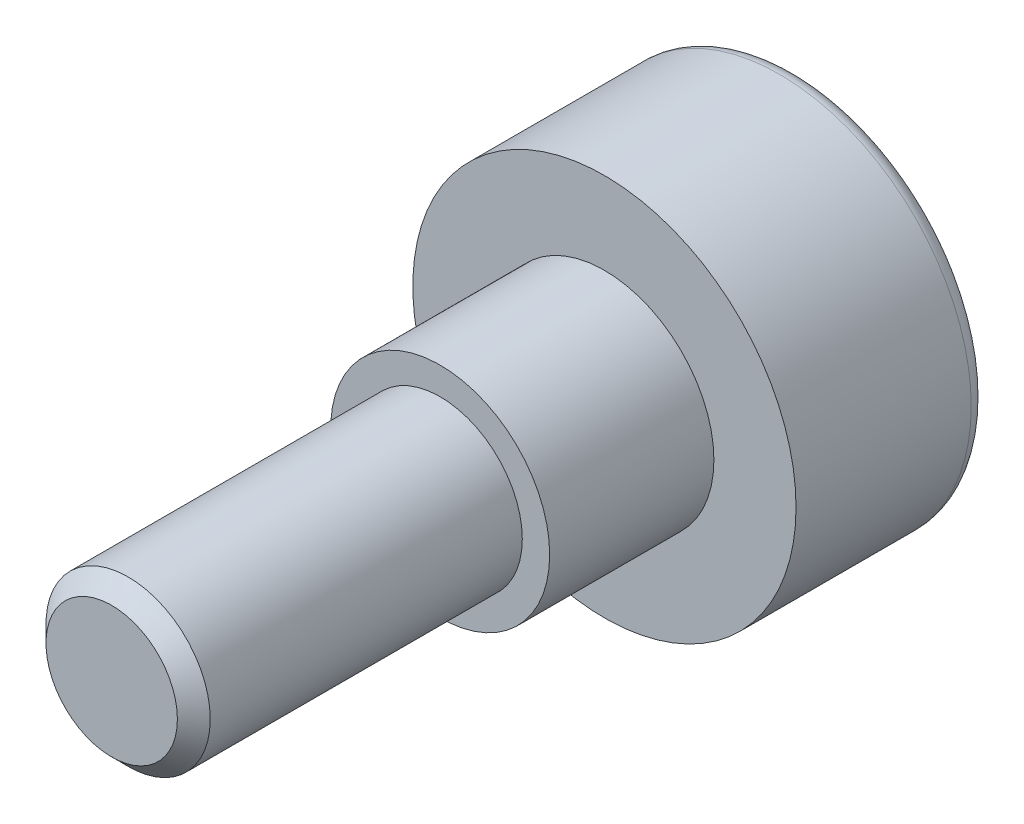
ISO-10303-21;
HEADER;
FILE_DESCRIPTION(('STEP AP214'),'2;1');
FILE_NAME('part.step','',(''),(''),'','','');
FILE_SCHEMA(('AUTOMOTIVE_DESIGN { 1 0 10303 214 1 1 1 1 }'));
ENDSEC;
DATA;
#1=APPLICATION_CONTEXT('core data for automotive mechanical design processes');
#2=APPLICATION_PROTOCOL_DEFINITION('international standard','automotive_design',2000,#1);
#3=PRODUCT_CONTEXT('',#1,'mechanical');
#4=PRODUCT('Part','Part','',(#3));
#5=PRODUCT_RELATED_PRODUCT_CATEGORY('part','',(#4));
#6=PRODUCT_DEFINITION_FORMATION('','',#4);
#7=PRODUCT_DEFINITION_CONTEXT('part definition',#1,'design');
#8=PRODUCT_DEFINITION('design','',#6,#7);
#9=PRODUCT_DEFINITION_SHAPE('','',#8);
#10=(LENGTH_UNIT() NAMED_UNIT(*) SI_UNIT(.MILLI.,.METRE.));
#11=(NAMED_UNIT(*) PLANE_ANGLE_UNIT() SI_UNIT($,.RADIAN.));
#12=(NAMED_UNIT(*) SI_UNIT($,.STERADIAN.) SOLID_ANGLE_UNIT());
#13=UNCERTAINTY_MEASURE_WITH_UNIT(LENGTH_MEASURE(1.E-05),#10,'distance_accuracy_value','');
#14=(GEOMETRIC_REPRESENTATION_CONTEXT(3) GLOBAL_UNCERTAINTY_ASSIGNED_CONTEXT((#13)) GLOBAL_UNIT_ASSIGNED_CONTEXT((#10,
#11,#12)) REPRESENTATION_CONTEXT('',''));
#15=CARTESIAN_POINT('',(0.,0.,0.));
#16=DIRECTION('',(0.,0.,1.));
#17=DIRECTION('',(1.,0.,0.));
#18=AXIS2_PLACEMENT_3D('',#15,#16,#17);
#19=CARTESIAN_POINT('',(0.,0.,3.5));
#20=DIRECTION('',(0.,0.,-1.));
#21=DIRECTION('',(-1.,0.,0.));
#22=AXIS2_PLACEMENT_3D('',#19,#20,#21);
#23=CYLINDRICAL_SURFACE('',#22,3.5);
#24=CARTESIAN_POINT('',(0.,0.,0.3));
#25=DIRECTION('',(0.,0.,1.));
#26=DIRECTION('',(1.,0.,0.));
#27=AXIS2_PLACEMENT_3D('',#24,#25,#26);
#28=CIRCLE('',#27,3.5);
#29=CARTESIAN_POINT('',(3.5,0.,0.3));
#30=VERTEX_POINT('',#29);
#31=EDGE_CURVE('E25',#30,#30,#28,.T.);
#32=ORIENTED_EDGE('',*,*,#31,.T.);
#33=EDGE_LOOP('',(#32));
#34=FACE_BOUND('',#33,.T.);
#35=CARTESIAN_POINT('',(0.,0.,3.5));
#36=DIRECTION('',(0.,0.,1.));
#37=DIRECTION('',(1.,0.,0.));
#38=AXIS2_PLACEMENT_3D('',#35,#36,#37);
#39=CIRCLE('',#38,3.5);
#40=CARTESIAN_POINT('',(3.5,0.,3.5));
#41=VERTEX_POINT('',#40);
#42=EDGE_CURVE('E131',#41,#41,#39,.T.);
#43=ORIENTED_EDGE('',*,*,#42,.F.);
#44=EDGE_LOOP('',(#43));
#45=FACE_BOUND('',#44,.T.);
#46=ADVANCED_FACE('F17',(#34,#45),#23,.T.);
#47=CARTESIAN_POINT('',(0.,0.,3.5));
#48=DIRECTION('',(0.,0.,1.));
#49=DIRECTION('',(1.,0.,0.));
#50=AXIS2_PLACEMENT_3D('',#47,#48,#49);
#51=PLANE('',#50);
#52=CARTESIAN_POINT('',(0.,0.,3.5));
#53=DIRECTION('',(0.,0.,1.));
#54=DIRECTION('',(1.,0.,0.));
#55=AXIS2_PLACEMENT_3D('',#52,#53,#54);
#56=CIRCLE('',#55,2.);
#57=CARTESIAN_POINT('',(2.,0.,3.5));
#58=VERTEX_POINT('',#57);
#59=EDGE_CURVE('E126',#58,#58,#56,.T.);
#60=ORIENTED_EDGE('',*,*,#59,.F.);
#61=EDGE_LOOP('',(#60));
#62=FACE_BOUND('',#61,.T.);
#63=ORIENTED_EDGE('',*,*,#42,.T.);
#64=EDGE_LOOP('',(#63));
#65=FACE_BOUND('',#64,.T.);
#66=ADVANCED_FACE('F160',(#62,#65),#51,.T.);
#67=CARTESIAN_POINT('',(0.,0.,0.));
#68=DIRECTION('',(0.,0.,1.));
#69=DIRECTION('',(1.,0.,0.));
#70=AXIS2_PLACEMENT_3D('',#67,#68,#69);
#71=PLANE('',#70);
#72=CARTESIAN_POINT('',(0.,0.,0.));
#73=DIRECTION('',(0.,0.,1.));
#74=DIRECTION('',(1.,0.,0.));
#75=AXIS2_PLACEMENT_3D('',#72,#73,#74);
#76=CIRCLE('',#75,3.2);
#77=CARTESIAN_POINT('',(3.2,0.,0.));
#78=VERTEX_POINT('',#77);
#79=EDGE_CURVE('E11',#78,#78,#76,.F.);
#80=ORIENTED_EDGE('',*,*,#79,.T.);
#81=EDGE_LOOP('',(#80));
#82=FACE_BOUND('',#81,.T.);
#83=DIRECTION('',(0.897749300355171,-0.440506746499758,0.));
#84=VECTOR('',#83,1.);
#85=CARTESIAN_POINT('',(-0.116713580587647,1.72811398353998,0.));
#86=LINE('',#85,#84);
#87=CARTESIAN_POINT('',(-0.116713580587647,1.72811398353998,0.));
#88=VERTEX_POINT('',#87);
#89=CARTESIAN_POINT('',(1.43823382008692,0.965133917525535,0.));
#90=VERTEX_POINT('',#89);
#91=EDGE_CURVE('E106',#88,#90,#86,.T.);
#92=ORIENTED_EDGE('',*,*,#91,.F.);
#93=DIRECTION('',(0.830364683184807,0.557220327087405,0.));
#94=VECTOR('',#93,1.);
#95=CARTESIAN_POINT('',(-1.55494740067457,0.762980066014444,0.));
#96=LINE('',#95,#94);
#97=CARTESIAN_POINT('',(-1.55494740067457,0.762980066014444,0.));
#98=VERTEX_POINT('',#97);
#99=EDGE_CURVE('E32',#98,#88,#96,.T.);
#100=ORIENTED_EDGE('',*,*,#99,.F.);
#101=DIRECTION('',(-0.0673846171703633,0.997727073587163,0.));
#102=VECTOR('',#101,1.);
#103=CARTESIAN_POINT('',(-1.43823382008692,-0.965133917525535,0.));
#104=LINE('',#103,#102);
#105=CARTESIAN_POINT('',(-1.43823382008692,-0.965133917525535,0.));
#106=VERTEX_POINT('',#105);
#107=EDGE_CURVE('E113',#106,#98,#104,.T.);
#108=ORIENTED_EDGE('',*,*,#107,.F.);
#109=DIRECTION('',(-0.897749300355171,0.440506746499758,0.));
#110=VECTOR('',#109,1.);
#111=CARTESIAN_POINT('',(0.116713580587647,-1.72811398353998,0.));
#112=LINE('',#111,#110);
#113=CARTESIAN_POINT('',(0.116713580587647,-1.72811398353998,0.));
#114=VERTEX_POINT('',#113);
#115=EDGE_CURVE('E114',#114,#106,#112,.T.);
#116=ORIENTED_EDGE('',*,*,#115,.F.);
#117=DIRECTION('',(-0.830364683184807,-0.557220327087405,0.));
#118=VECTOR('',#117,1.);
#119=CARTESIAN_POINT('',(1.55494740067457,-0.762980066014444,0.));
#120=LINE('',#119,#118);
#121=CARTESIAN_POINT('',(1.55494740067457,-0.762980066014444,0.));
#122=VERTEX_POINT('',#121);
#123=EDGE_CURVE('E79',#122,#114,#120,.T.);
#124=ORIENTED_EDGE('',*,*,#123,.F.);
#125=DIRECTION('',(0.0673846171703631,-0.997727073587163,0.));
#126=VECTOR('',#125,1.);
#127=CARTESIAN_POINT('',(1.43823382008692,0.965133917525535,0.));
#128=LINE('',#127,#126);
#129=EDGE_CURVE('E108',#90,#122,#128,.T.);
#130=ORIENTED_EDGE('',*,*,#129,.F.);
#131=EDGE_LOOP('',(#92,#100,#108,#116,#124,#130));
#132=FACE_BOUND('',#131,.T.);
#133=ADVANCED_FACE('F162',(#82,#132),#71,.F.);
#134=CARTESIAN_POINT('',(0.,0.,6.5));
#135=DIRECTION('',(0.,0.,-1.));
#136=DIRECTION('',(-1.,0.,0.));
#137=AXIS2_PLACEMENT_3D('',#134,#135,#136);
#138=CYLINDRICAL_SURFACE('',#137,2.);
#139=CARTESIAN_POINT('',(0.,0.,6.5));
#140=DIRECTION('',(0.,0.,1.));
#141=DIRECTION('',(1.,0.,0.));
#142=AXIS2_PLACEMENT_3D('',#139,#140,#141);
#143=CIRCLE('',#142,2.);
#144=CARTESIAN_POINT('',(2.,0.,6.5));
#145=VERTEX_POINT('',#144);
#146=EDGE_CURVE('E128',#145,#145,#143,.T.);
#147=ORIENTED_EDGE('',*,*,#146,.F.);
#148=EDGE_LOOP('',(#147));
#149=FACE_BOUND('',#148,.T.);
#150=ORIENTED_EDGE('',*,*,#59,.T.);
#151=EDGE_LOOP('',(#150));
#152=FACE_BOUND('',#151,.T.);
#153=ADVANCED_FACE('F191',(#149,#152),#138,.T.);
#154=CARTESIAN_POINT('',(0.,0.,6.5));
#155=DIRECTION('',(0.,0.,1.));
#156=DIRECTION('',(1.,0.,0.));
#157=AXIS2_PLACEMENT_3D('',#154,#155,#156);
#158=PLANE('',#157);
#159=CARTESIAN_POINT('',(0.,0.,6.5));
#160=DIRECTION('',(0.,0.,1.));
#161=DIRECTION('',(1.,0.,0.));
#162=AXIS2_PLACEMENT_3D('',#159,#160,#161);
#163=CIRCLE('',#162,1.5);
#164=CARTESIAN_POINT('',(1.5,0.,6.5));
#165=VERTEX_POINT('',#164);
#166=EDGE_CURVE('E118',#165,#165,#163,.T.);
#167=ORIENTED_EDGE('',*,*,#166,.F.);
#168=EDGE_LOOP('',(#167));
#169=FACE_BOUND('',#168,.T.);
#170=ORIENTED_EDGE('',*,*,#146,.T.);
#171=EDGE_LOOP('',(#170));
#172=FACE_BOUND('',#171,.T.);
#173=ADVANCED_FACE('F187',(#169,#172),#158,.T.);
#174=CARTESIAN_POINT('',(0.,0.,12.5));
#175=DIRECTION('',(0.,0.,-1.));
#176=DIRECTION('',(-1.,0.,0.));
#177=AXIS2_PLACEMENT_3D('',#174,#175,#176);
#178=CYLINDRICAL_SURFACE('',#177,1.5);
#179=CARTESIAN_POINT('',(0.,0.,12.2));
#180=DIRECTION('',(0.,0.,1.));
#181=DIRECTION('',(1.,0.,0.));
#182=AXIS2_PLACEMENT_3D('',#179,#180,#181);
#183=CIRCLE('',#182,1.5);
#184=CARTESIAN_POINT('',(1.5,0.,12.2));
#185=VERTEX_POINT('',#184);
#186=EDGE_CURVE('E136',#185,#185,#183,.F.);
#187=ORIENTED_EDGE('',*,*,#186,.T.);
#188=EDGE_LOOP('',(#187));
#189=FACE_BOUND('',#188,.T.);
#190=ORIENTED_EDGE('',*,*,#166,.T.);
#191=EDGE_LOOP('',(#190));
#192=FACE_BOUND('',#191,.T.);
#193=ADVANCED_FACE('F180',(#189,#192),#178,.T.);
#194=CARTESIAN_POINT('',(0.,0.,12.5));
#195=DIRECTION('',(0.,0.,1.));
#196=DIRECTION('',(1.,0.,0.));
#197=AXIS2_PLACEMENT_3D('',#194,#195,#196);
#198=PLANE('',#197);
#199=CARTESIAN_POINT('',(0.,0.,12.5));
#200=DIRECTION('',(0.,0.,1.));
#201=DIRECTION('',(1.,0.,0.));
#202=AXIS2_PLACEMENT_3D('',#199,#200,#201);
#203=CIRCLE('',#202,1.2);
#204=CARTESIAN_POINT('',(1.2,0.,12.5));
#205=VERTEX_POINT('',#204);
#206=EDGE_CURVE('E137',#205,#205,#203,.T.);
#207=ORIENTED_EDGE('',*,*,#206,.T.);
#208=EDGE_LOOP('',(#207));
#209=FACE_BOUND('',#208,.T.);
#210=ADVANCED_FACE('F168',(#209),#198,.T.);
#211=CARTESIAN_POINT('',(0.,0.,12.5));
#212=DIRECTION('',(0.,0.,-1.));
#213=DIRECTION('',(-1.,0.,0.));
#214=AXIS2_PLACEMENT_3D('',#211,#212,#213);
#215=CONICAL_SURFACE('',#214,1.2,0.785398163397446);
#216=ORIENTED_EDGE('',*,*,#186,.F.);
#217=EDGE_LOOP('',(#216));
#218=FACE_BOUND('',#217,.T.);
#219=ORIENTED_EDGE('',*,*,#206,.F.);
#220=EDGE_LOOP('',(#219));
#221=FACE_BOUND('',#220,.T.);
#222=ADVANCED_FACE('F170',(#218,#221),#215,.T.);
#223=CARTESIAN_POINT('',(-1.55494740067457,0.762980066014444,3.));
#224=DIRECTION('',(-0.557220327087405,0.830364683184807,0.));
#225=DIRECTION('',(-0.830364683184807,-0.557220327087405,0.));
#226=AXIS2_PLACEMENT_3D('',#223,#224,#225);
#227=PLANE('',#226);
#228=ORIENTED_EDGE('',*,*,#99,.T.);
#229=DIRECTION('',(0.,0.,-1.));
#230=VECTOR('',#229,1.);
#231=CARTESIAN_POINT('',(-0.116713580587647,1.72811398353998,3.));
#232=LINE('',#231,#230);
#233=CARTESIAN_POINT('',(-0.116713580587647,1.72811398353998,3.));
#234=VERTEX_POINT('',#233);
#235=EDGE_CURVE('E62',#234,#88,#232,.T.);
#236=ORIENTED_EDGE('',*,*,#235,.F.);
#237=DIRECTION('',(0.830364683184807,0.557220327087405,0.));
#238=VECTOR('',#237,1.);
#239=CARTESIAN_POINT('',(-1.55494740067457,0.762980066014444,3.));
#240=LINE('',#239,#238);
#241=CARTESIAN_POINT('',(-1.55494740067457,0.762980066014444,3.));
#242=VERTEX_POINT('',#241);
#243=EDGE_CURVE('E117',#242,#234,#240,.T.);
#244=ORIENTED_EDGE('',*,*,#243,.F.);
#245=DIRECTION('',(0.,0.,-1.));
#246=VECTOR('',#245,1.);
#247=CARTESIAN_POINT('',(-1.55494740067457,0.762980066014444,3.));
#248=LINE('',#247,#246);
#249=EDGE_CURVE('E37',#242,#98,#248,.T.);
#250=ORIENTED_EDGE('',*,*,#249,.T.);
#251=EDGE_LOOP('',(#228,#236,#244,#250));
#252=FACE_BOUND('',#251,.T.);
#253=ADVANCED_FACE('F166',(#252),#227,.F.);
#254=CARTESIAN_POINT('',(-1.43823382008692,-0.965133917525535,3.));
#255=DIRECTION('',(-0.997727073587163,-0.0673846171703633,0.));
#256=DIRECTION('',(0.0673846171703633,-0.997727073587163,0.));
#257=AXIS2_PLACEMENT_3D('',#254,#255,#256);
#258=PLANE('',#257);
#259=ORIENTED_EDGE('',*,*,#107,.T.);
#260=ORIENTED_EDGE('',*,*,#249,.F.);
#261=DIRECTION('',(-0.0673846171703633,0.997727073587163,0.));
#262=VECTOR('',#261,1.);
#263=CARTESIAN_POINT('',(-1.43823382008692,-0.965133917525535,3.));
#264=LINE('',#263,#262);
#265=CARTESIAN_POINT('',(-1.43823382008692,-0.965133917525535,3.));
#266=VERTEX_POINT('',#265);
#267=EDGE_CURVE('E95',#266,#242,#264,.T.);
#268=ORIENTED_EDGE('',*,*,#267,.F.);
#269=DIRECTION('',(0.,0.,-1.));
#270=VECTOR('',#269,1.);
#271=CARTESIAN_POINT('',(-1.43823382008692,-0.965133917525535,3.));
#272=LINE('',#271,#270);
#273=EDGE_CURVE('E81',#266,#106,#272,.T.);
#274=ORIENTED_EDGE('',*,*,#273,.T.);
#275=EDGE_LOOP('',(#259,#260,#268,#274));
#276=FACE_BOUND('',#275,.T.);
#277=ADVANCED_FACE('F179',(#276),#258,.F.);
#278=CARTESIAN_POINT('',(0.116713580587647,-1.72811398353998,3.));
#279=DIRECTION('',(-0.440506746499758,-0.897749300355171,0.));
#280=DIRECTION('',(0.897749300355171,-0.440506746499758,0.));
#281=AXIS2_PLACEMENT_3D('',#278,#279,#280);
#282=PLANE('',#281);
#283=ORIENTED_EDGE('',*,*,#115,.T.);
#284=ORIENTED_EDGE('',*,*,#273,.F.);
#285=DIRECTION('',(-0.897749300355171,0.440506746499758,0.));
#286=VECTOR('',#285,1.);
#287=CARTESIAN_POINT('',(0.116713580587647,-1.72811398353998,3.));
#288=LINE('',#287,#286);
#289=CARTESIAN_POINT('',(0.116713580587647,-1.72811398353998,3.));
#290=VERTEX_POINT('',#289);
#291=EDGE_CURVE('E86',#290,#266,#288,.T.);
#292=ORIENTED_EDGE('',*,*,#291,.F.);
#293=DIRECTION('',(0.,0.,-1.));
#294=VECTOR('',#293,1.);
#295=CARTESIAN_POINT('',(0.116713580587647,-1.72811398353998,3.));
#296=LINE('',#295,#294);
#297=EDGE_CURVE('E73',#290,#114,#296,.T.);
#298=ORIENTED_EDGE('',*,*,#297,.T.);
#299=EDGE_LOOP('',(#283,#284,#292,#298));
#300=FACE_BOUND('',#299,.T.);
#301=ADVANCED_FACE('F90',(#300),#282,.F.);
#302=CARTESIAN_POINT('',(1.55494740067457,-0.762980066014444,3.));
#303=DIRECTION('',(0.557220327087405,-0.830364683184807,0.));
#304=DIRECTION('',(0.830364683184807,0.557220327087405,0.));
#305=AXIS2_PLACEMENT_3D('',#302,#303,#304);
#306=PLANE('',#305);
#307=ORIENTED_EDGE('',*,*,#123,.T.);
#308=ORIENTED_EDGE('',*,*,#297,.F.);
#309=DIRECTION('',(-0.830364683184807,-0.557220327087405,0.));
#310=VECTOR('',#309,1.);
#311=CARTESIAN_POINT('',(1.55494740067457,-0.762980066014444,3.));
#312=LINE('',#311,#310);
#313=CARTESIAN_POINT('',(1.55494740067457,-0.762980066014444,3.));
#314=VERTEX_POINT('',#313);
#315=EDGE_CURVE('E80',#314,#290,#312,.T.);
#316=ORIENTED_EDGE('',*,*,#315,.F.);
#317=DIRECTION('',(0.,0.,-1.));
#318=VECTOR('',#317,1.);
#319=CARTESIAN_POINT('',(1.55494740067457,-0.762980066014444,3.));
#320=LINE('',#319,#318);
#321=EDGE_CURVE('E83',#314,#122,#320,.T.);
#322=ORIENTED_EDGE('',*,*,#321,.T.);
#323=EDGE_LOOP('',(#307,#308,#316,#322));
#324=FACE_BOUND('',#323,.T.);
#325=ADVANCED_FACE('F74',(#324),#306,.F.);
#326=CARTESIAN_POINT('',(1.43823382008692,0.965133917525535,3.));
#327=DIRECTION('',(0.997727073587163,0.067384617170363,0.));
#328=DIRECTION('',(-0.0673846171703631,0.997727073587163,0.));
#329=AXIS2_PLACEMENT_3D('',#326,#327,#328);
#330=PLANE('',#329);
#331=ORIENTED_EDGE('',*,*,#129,.T.);
#332=ORIENTED_EDGE('',*,*,#321,.F.);
#333=DIRECTION('',(0.0673846171703631,-0.997727073587163,0.));
#334=VECTOR('',#333,1.);
#335=CARTESIAN_POINT('',(1.43823382008692,0.965133917525535,3.));
#336=LINE('',#335,#334);
#337=CARTESIAN_POINT('',(1.43823382008692,0.965133917525535,3.));
#338=VERTEX_POINT('',#337);
#339=EDGE_CURVE('E98',#338,#314,#336,.T.);
#340=ORIENTED_EDGE('',*,*,#339,.F.);
#341=DIRECTION('',(0.,0.,-1.));
#342=VECTOR('',#341,1.);
#343=CARTESIAN_POINT('',(1.43823382008692,0.965133917525535,3.));
#344=LINE('',#343,#342);
#345=EDGE_CURVE('E124',#338,#90,#344,.T.);
#346=ORIENTED_EDGE('',*,*,#345,.T.);
#347=EDGE_LOOP('',(#331,#332,#340,#346));
#348=FACE_BOUND('',#347,.T.);
#349=ADVANCED_FACE('F215',(#348),#330,.F.);
#350=CARTESIAN_POINT('',(-0.116713580587647,1.72811398353998,3.));
#351=DIRECTION('',(0.440506746499758,0.897749300355171,0.));
#352=DIRECTION('',(-0.897749300355171,0.440506746499758,0.));
#353=AXIS2_PLACEMENT_3D('',#350,#351,#352);
#354=PLANE('',#353);
#355=ORIENTED_EDGE('',*,*,#91,.T.);
#356=ORIENTED_EDGE('',*,*,#345,.F.);
#357=DIRECTION('',(0.897749300355171,-0.440506746499758,0.));
#358=VECTOR('',#357,1.);
#359=CARTESIAN_POINT('',(-0.116713580587647,1.72811398353998,3.));
#360=LINE('',#359,#358);
#361=EDGE_CURVE('E99',#234,#338,#360,.T.);
#362=ORIENTED_EDGE('',*,*,#361,.F.);
#363=ORIENTED_EDGE('',*,*,#235,.T.);
#364=EDGE_LOOP('',(#355,#356,#362,#363));
#365=FACE_BOUND('',#364,.T.);
#366=ADVANCED_FACE('F153',(#365),#354,.F.);
#367=CARTESIAN_POINT('',(0.,0.,3.));
#368=DIRECTION('',(0.,0.,-1.));
#369=DIRECTION('',(-1.,0.,0.));
#370=AXIS2_PLACEMENT_3D('',#367,#368,#369);
#371=PLANE('',#370);
#372=ORIENTED_EDGE('',*,*,#243,.T.);
#373=ORIENTED_EDGE('',*,*,#361,.T.);
#374=ORIENTED_EDGE('',*,*,#339,.T.);
#375=ORIENTED_EDGE('',*,*,#315,.T.);
#376=ORIENTED_EDGE('',*,*,#291,.T.);
#377=ORIENTED_EDGE('',*,*,#267,.T.);
#378=EDGE_LOOP('',(#372,#373,#374,#375,#376,#377));
#379=FACE_BOUND('',#378,.T.);
#380=ADVANCED_FACE('F92',(#379),#371,.T.);
#381=CARTESIAN_POINT('',(0.,0.,0.3));
#382=DIRECTION('',(0.,0.,1.));
#383=DIRECTION('',(1.,0.,0.));
#384=AXIS2_PLACEMENT_3D('',#381,#382,#383);
#385=TOROIDAL_SURFACE('',#384,3.2,0.3);
#386=ORIENTED_EDGE('',*,*,#79,.F.);
#387=EDGE_LOOP('',(#386));
#388=FACE_BOUND('',#387,.T.);
#389=ORIENTED_EDGE('',*,*,#31,.F.);
#390=EDGE_LOOP('',(#389));
#391=FACE_BOUND('',#390,.T.);
#392=ADVANCED_FACE('F19',(#388,#391),#385,.T.);
#393=CLOSED_SHELL('',(#46,#66,#133,#153,#173,#193,#210,#222,#253,#277,#301,#325,#349,#366,#380,#392));
#394=MANIFOLD_SOLID_BREP('B1',#393);
#395=ADVANCED_BREP_SHAPE_REPRESENTATION('',(#18,#394),#14);
#396=SHAPE_DEFINITION_REPRESENTATION(#9,#395);
ENDSEC;
END-ISO-10303-21;
